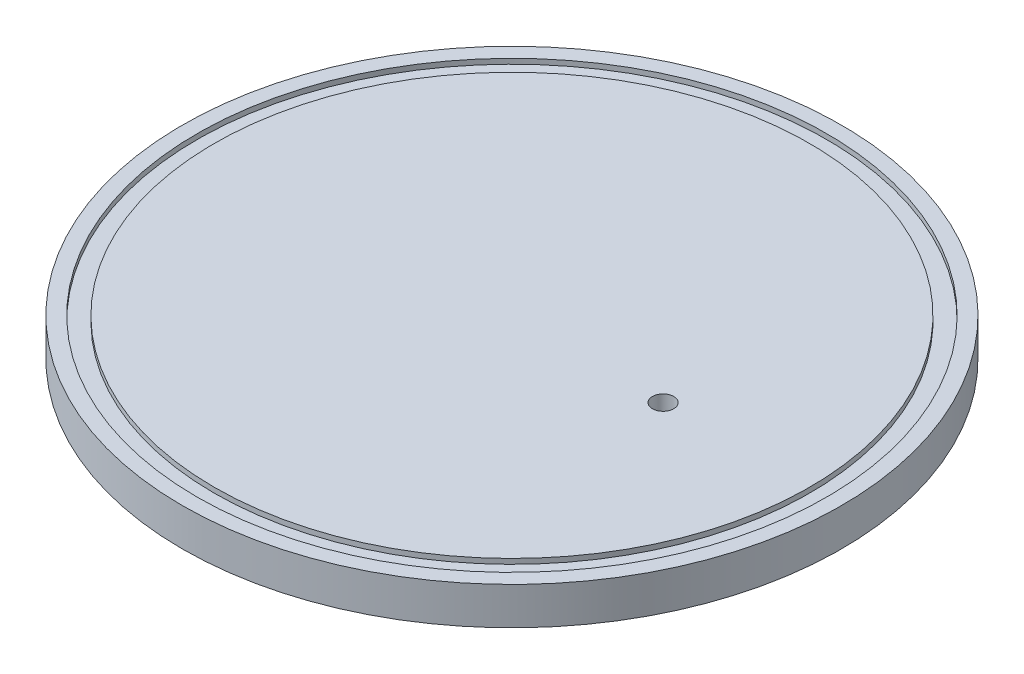
ISO-10303-21;
HEADER;
FILE_DESCRIPTION(('STEP AP214'),'2;1');
FILE_NAME('part.step','',(''),(''),'','','');
FILE_SCHEMA(('AUTOMOTIVE_DESIGN { 1 0 10303 214 1 1 1 1 }'));
ENDSEC;
DATA;
#1=APPLICATION_CONTEXT('core data for automotive mechanical design processes');
#2=APPLICATION_PROTOCOL_DEFINITION('international standard','automotive_design',2000,#1);
#3=PRODUCT_CONTEXT('',#1,'mechanical');
#4=PRODUCT('Part','Part','',(#3));
#5=PRODUCT_RELATED_PRODUCT_CATEGORY('part','',(#4));
#6=PRODUCT_DEFINITION_FORMATION('','',#4);
#7=PRODUCT_DEFINITION_CONTEXT('part definition',#1,'design');
#8=PRODUCT_DEFINITION('design','',#6,#7);
#9=PRODUCT_DEFINITION_SHAPE('','',#8);
#10=(LENGTH_UNIT() NAMED_UNIT(*) SI_UNIT(.MILLI.,.METRE.));
#11=(NAMED_UNIT(*) PLANE_ANGLE_UNIT() SI_UNIT($,.RADIAN.));
#12=(NAMED_UNIT(*) SI_UNIT($,.STERADIAN.) SOLID_ANGLE_UNIT());
#13=UNCERTAINTY_MEASURE_WITH_UNIT(LENGTH_MEASURE(1.E-05),#10,'distance_accuracy_value','');
#14=(GEOMETRIC_REPRESENTATION_CONTEXT(3) GLOBAL_UNCERTAINTY_ASSIGNED_CONTEXT((#13)) GLOBAL_UNIT_ASSIGNED_CONTEXT((#10,
#11,#12)) REPRESENTATION_CONTEXT('',''));
#15=CARTESIAN_POINT('',(0.,0.,0.));
#16=DIRECTION('',(0.,0.,1.));
#17=DIRECTION('',(1.,0.,0.));
#18=AXIS2_PLACEMENT_3D('',#15,#16,#17);
#19=CARTESIAN_POINT('',(0.,0.,0.));
#20=DIRECTION('',(0.,1.,0.));
#21=DIRECTION('',(0.,0.,1.));
#22=AXIS2_PLACEMENT_3D('',#19,#20,#21);
#23=PLANE('',#22);
#24=CARTESIAN_POINT('',(17.7,0.,0.));
#25=DIRECTION('',(0.,-1.,0.));
#26=DIRECTION('',(0.,0.,-1.));
#27=AXIS2_PLACEMENT_3D('',#24,#25,#26);
#28=CIRCLE('',#27,1.25);
#29=CARTESIAN_POINT('',(17.7,0.,-1.25));
#30=VERTEX_POINT('',#29);
#31=EDGE_CURVE('E259',#30,#30,#28,.T.);
#32=ORIENTED_EDGE('',*,*,#31,.F.);
#33=EDGE_LOOP('',(#32));
#34=FACE_BOUND('',#33,.T.);
#35=DIRECTION('',(0.,0.,-1.));
#36=VECTOR('',#35,1.);
#37=CARTESIAN_POINT('',(-2.5,0.,19.5));
#38=LINE('',#37,#36);
#39=CARTESIAN_POINT('',(-2.5,0.,19.5));
#40=VERTEX_POINT('',#39);
#41=CARTESIAN_POINT('',(-2.5,0.,10.5));
#42=VERTEX_POINT('',#41);
#43=EDGE_CURVE('E157',#40,#42,#38,.T.);
#44=ORIENTED_EDGE('',*,*,#43,.F.);
#45=DIRECTION('',(-1.,0.,0.));
#46=VECTOR('',#45,1.);
#47=CARTESIAN_POINT('',(2.5,0.,19.5));
#48=LINE('',#47,#46);
#49=CARTESIAN_POINT('',(2.5,0.,19.5));
#50=VERTEX_POINT('',#49);
#51=EDGE_CURVE('E169',#50,#40,#48,.T.);
#52=ORIENTED_EDGE('',*,*,#51,.F.);
#53=DIRECTION('',(0.,0.,1.));
#54=VECTOR('',#53,1.);
#55=CARTESIAN_POINT('',(2.5,0.,19.5));
#56=LINE('',#55,#54);
#57=CARTESIAN_POINT('',(2.5,0.,10.5));
#58=VERTEX_POINT('',#57);
#59=EDGE_CURVE('E165',#58,#50,#56,.T.);
#60=ORIENTED_EDGE('',*,*,#59,.F.);
#61=DIRECTION('',(1.,0.,0.));
#62=VECTOR('',#61,1.);
#63=CARTESIAN_POINT('',(2.5,0.,10.5));
#64=LINE('',#63,#62);
#65=EDGE_CURVE('E161',#42,#58,#64,.T.);
#66=ORIENTED_EDGE('',*,*,#65,.F.);
#67=EDGE_LOOP('',(#44,#52,#60,#66));
#68=FACE_BOUND('',#67,.T.);
#69=CARTESIAN_POINT('',(0.,0.,0.));
#70=DIRECTION('',(0.,1.,0.));
#71=DIRECTION('',(0.,0.,1.));
#72=AXIS2_PLACEMENT_3D('',#69,#70,#71);
#73=CIRCLE('',#72,38.5983960185112);
#74=CARTESIAN_POINT('',(0.,0.,38.5983960185112));
#75=VERTEX_POINT('',#74);
#76=EDGE_CURVE('E198',#75,#75,#73,.T.);
#77=ORIENTED_EDGE('',*,*,#76,.F.);
#78=EDGE_LOOP('',(#77));
#79=FACE_BOUND('',#78,.T.);
#80=DIRECTION('',(0.,0.,1.));
#81=VECTOR('',#80,1.);
#82=CARTESIAN_POINT('',(2.5,0.,-10.5));
#83=LINE('',#82,#81);
#84=CARTESIAN_POINT('',(2.5,0.,-19.5));
#85=VERTEX_POINT('',#84);
#86=CARTESIAN_POINT('',(2.5,0.,-10.5));
#87=VERTEX_POINT('',#86);
#88=EDGE_CURVE('E119',#85,#87,#83,.T.);
#89=ORIENTED_EDGE('',*,*,#88,.F.);
#90=DIRECTION('',(1.,0.,0.));
#91=VECTOR('',#90,1.);
#92=CARTESIAN_POINT('',(-2.5,0.,-19.5));
#93=LINE('',#92,#91);
#94=CARTESIAN_POINT('',(-2.5,0.,-19.5));
#95=VERTEX_POINT('',#94);
#96=EDGE_CURVE('E128',#95,#85,#93,.T.);
#97=ORIENTED_EDGE('',*,*,#96,.F.);
#98=DIRECTION('',(0.,0.,-1.));
#99=VECTOR('',#98,1.);
#100=CARTESIAN_POINT('',(-2.5,0.,-10.5));
#101=LINE('',#100,#99);
#102=CARTESIAN_POINT('',(-2.5,0.,-10.5));
#103=VERTEX_POINT('',#102);
#104=EDGE_CURVE('E143',#103,#95,#101,.T.);
#105=ORIENTED_EDGE('',*,*,#104,.F.);
#106=DIRECTION('',(-1.,0.,0.));
#107=VECTOR('',#106,1.);
#108=CARTESIAN_POINT('',(-2.5,0.,-10.5));
#109=LINE('',#108,#107);
#110=EDGE_CURVE('E136',#87,#103,#109,.T.);
#111=ORIENTED_EDGE('',*,*,#110,.F.);
#112=EDGE_LOOP('',(#89,#97,#105,#111));
#113=FACE_BOUND('',#112,.T.);
#114=ADVANCED_FACE('F39',(#34,#68,#79,#113),#23,.F.);
#115=CARTESIAN_POINT('',(0.,4.4,0.));
#116=DIRECTION('',(0.,-1.,0.));
#117=DIRECTION('',(0.,0.,-1.));
#118=AXIS2_PLACEMENT_3D('',#115,#116,#117);
#119=CYLINDRICAL_SURFACE('',#118,38.5983960185112);
#120=CARTESIAN_POINT('',(0.,4.4,0.));
#121=DIRECTION('',(0.,1.,0.));
#122=DIRECTION('',(0.,0.,1.));
#123=AXIS2_PLACEMENT_3D('',#120,#121,#122);
#124=CIRCLE('',#123,38.5983960185112);
#125=CARTESIAN_POINT('',(0.,4.4,38.5983960185112));
#126=VERTEX_POINT('',#125);
#127=EDGE_CURVE('E202',#126,#126,#124,.T.);
#128=ORIENTED_EDGE('',*,*,#127,.F.);
#129=EDGE_LOOP('',(#128));
#130=FACE_BOUND('',#129,.T.);
#131=ORIENTED_EDGE('',*,*,#76,.T.);
#132=EDGE_LOOP('',(#131));
#133=FACE_BOUND('',#132,.T.);
#134=ADVANCED_FACE('F292',(#130,#133),#119,.T.);
#135=CARTESIAN_POINT('',(0.,4.4,0.));
#136=DIRECTION('',(0.,1.,0.));
#137=DIRECTION('',(0.,0.,1.));
#138=AXIS2_PLACEMENT_3D('',#135,#136,#137);
#139=PLANE('',#138);
#140=CARTESIAN_POINT('',(0.,4.4,0.));
#141=DIRECTION('',(0.,1.,0.));
#142=DIRECTION('',(0.,0.,1.));
#143=AXIS2_PLACEMENT_3D('',#140,#141,#142);
#144=CIRCLE('',#143,36.8699223290354);
#145=CARTESIAN_POINT('',(0.,4.4,36.8699223290354));
#146=VERTEX_POINT('',#145);
#147=EDGE_CURVE('E190',#146,#146,#144,.T.);
#148=ORIENTED_EDGE('',*,*,#147,.F.);
#149=EDGE_LOOP('',(#148));
#150=FACE_BOUND('',#149,.T.);
#151=ORIENTED_EDGE('',*,*,#127,.T.);
#152=EDGE_LOOP('',(#151));
#153=FACE_BOUND('',#152,.T.);
#154=ADVANCED_FACE('F298',(#150,#153),#139,.T.);
#155=CARTESIAN_POINT('',(0.,3.8,0.));
#156=DIRECTION('',(0.,1.,0.));
#157=DIRECTION('',(0.,0.,1.));
#158=AXIS2_PLACEMENT_3D('',#155,#156,#157);
#159=CYLINDRICAL_SURFACE('',#158,36.8699223290354);
#160=CARTESIAN_POINT('',(0.,3.8,0.));
#161=DIRECTION('',(0.,1.,0.));
#162=DIRECTION('',(0.,0.,1.));
#163=AXIS2_PLACEMENT_3D('',#160,#161,#162);
#164=CIRCLE('',#163,36.8699223290354);
#165=CARTESIAN_POINT('',(0.,3.8,36.8699223290354));
#166=VERTEX_POINT('',#165);
#167=EDGE_CURVE('E194',#166,#166,#164,.T.);
#168=ORIENTED_EDGE('',*,*,#167,.F.);
#169=EDGE_LOOP('',(#168));
#170=FACE_BOUND('',#169,.T.);
#171=ORIENTED_EDGE('',*,*,#147,.T.);
#172=EDGE_LOOP('',(#171));
#173=FACE_BOUND('',#172,.T.);
#174=ADVANCED_FACE('F357',(#170,#173),#159,.F.);
#175=CARTESIAN_POINT('',(0.,3.8,0.));
#176=DIRECTION('',(0.,1.,0.));
#177=DIRECTION('',(0.,0.,1.));
#178=AXIS2_PLACEMENT_3D('',#175,#176,#177);
#179=PLANE('',#178);
#180=CARTESIAN_POINT('',(0.,3.8,0.));
#181=DIRECTION('',(0.,1.,0.));
#182=DIRECTION('',(0.,0.,1.));
#183=AXIS2_PLACEMENT_3D('',#180,#181,#182);
#184=CIRCLE('',#183,34.8699223290354);
#185=CARTESIAN_POINT('',(0.,3.8,34.8699223290354));
#186=VERTEX_POINT('',#185);
#187=EDGE_CURVE('E186',#186,#186,#184,.T.);
#188=ORIENTED_EDGE('',*,*,#187,.F.);
#189=EDGE_LOOP('',(#188));
#190=FACE_BOUND('',#189,.T.);
#191=ORIENTED_EDGE('',*,*,#167,.T.);
#192=EDGE_LOOP('',(#191));
#193=FACE_BOUND('',#192,.T.);
#194=ADVANCED_FACE('F354',(#190,#193),#179,.T.);
#195=CARTESIAN_POINT('',(0.,3.8,0.));
#196=DIRECTION('',(0.,1.,0.));
#197=DIRECTION('',(0.,0.,1.));
#198=AXIS2_PLACEMENT_3D('',#195,#196,#197);
#199=CYLINDRICAL_SURFACE('',#198,34.8699223290354);
#200=ORIENTED_EDGE('',*,*,#187,.T.);
#201=EDGE_LOOP('',(#200));
#202=FACE_BOUND('',#201,.T.);
#203=CARTESIAN_POINT('',(0.,4.4,0.));
#204=DIRECTION('',(0.,1.,0.));
#205=DIRECTION('',(0.,0.,1.));
#206=AXIS2_PLACEMENT_3D('',#203,#204,#205);
#207=CIRCLE('',#206,34.8699223290354);
#208=CARTESIAN_POINT('',(0.,4.4,34.8699223290354));
#209=VERTEX_POINT('',#208);
#210=EDGE_CURVE('E185',#209,#209,#207,.T.);
#211=ORIENTED_EDGE('',*,*,#210,.F.);
#212=EDGE_LOOP('',(#211));
#213=FACE_BOUND('',#212,.T.);
#214=ADVANCED_FACE('F349',(#202,#213),#199,.T.);
#215=CARTESIAN_POINT('',(17.7,4.4,0.));
#216=DIRECTION('',(0.,-1.,0.));
#217=DIRECTION('',(0.,0.,-1.));
#218=AXIS2_PLACEMENT_3D('',#215,#216,#217);
#219=CIRCLE('',#218,1.25);
#220=CARTESIAN_POINT('',(17.7,4.4,-1.25));
#221=VERTEX_POINT('',#220);
#222=EDGE_CURVE('E251',#221,#221,#219,.T.);
#223=ORIENTED_EDGE('',*,*,#222,.T.);
#224=EDGE_LOOP('',(#223));
#225=FACE_BOUND('',#224,.T.);
#226=ORIENTED_EDGE('',*,*,#210,.T.);
#227=EDGE_LOOP('',(#226));
#228=FACE_BOUND('',#227,.T.);
#229=ADVANCED_FACE('F341',(#225,#228),#139,.T.);
#230=CARTESIAN_POINT('',(-2.5,-14.5,19.5));
#231=DIRECTION('',(1.,0.,0.));
#232=DIRECTION('',(0.,0.,-1.));
#233=AXIS2_PLACEMENT_3D('',#230,#231,#232);
#234=PLANE('',#233);
#235=CARTESIAN_POINT('',(-2.5,-10.,15.));
#236=DIRECTION('',(1.,0.,0.));
#237=DIRECTION('',(0.,0.,-1.));
#238=AXIS2_PLACEMENT_3D('',#235,#236,#237);
#239=CIRCLE('',#238,1.55);
#240=CARTESIAN_POINT('',(-2.5,-10.,16.55));
#241=VERTEX_POINT('',#240);
#242=EDGE_CURVE('E246',#241,#241,#239,.T.);
#243=ORIENTED_EDGE('',*,*,#242,.T.);
#244=EDGE_LOOP('',(#243));
#245=FACE_BOUND('',#244,.T.);
#246=CARTESIAN_POINT('',(-2.5,-10.,15.));
#247=DIRECTION('',(1.,0.,0.));
#248=DIRECTION('',(0.,0.,-1.));
#249=AXIS2_PLACEMENT_3D('',#246,#247,#248);
#250=CIRCLE('',#249,4.5);
#251=CARTESIAN_POINT('',(-2.5,-10.,10.5));
#252=VERTEX_POINT('',#251);
#253=CARTESIAN_POINT('',(-2.5,-14.5,15.));
#254=VERTEX_POINT('',#253);
#255=EDGE_CURVE('E226',#252,#254,#250,.F.);
#256=ORIENTED_EDGE('',*,*,#255,.T.);
#257=CARTESIAN_POINT('',(-2.5,-10.,15.));
#258=DIRECTION('',(1.,0.,0.));
#259=DIRECTION('',(0.,0.,-1.));
#260=AXIS2_PLACEMENT_3D('',#257,#258,#259);
#261=CIRCLE('',#260,4.5);
#262=CARTESIAN_POINT('',(-2.5,-10.,19.5));
#263=VERTEX_POINT('',#262);
#264=EDGE_CURVE('E229',#254,#263,#261,.F.);
#265=ORIENTED_EDGE('',*,*,#264,.T.);
#266=DIRECTION('',(0.,1.,0.));
#267=VECTOR('',#266,1.);
#268=CARTESIAN_POINT('',(-2.5,-14.5,19.5));
#269=LINE('',#268,#267);
#270=EDGE_CURVE('E173',#263,#40,#269,.T.);
#271=ORIENTED_EDGE('',*,*,#270,.T.);
#272=ORIENTED_EDGE('',*,*,#43,.T.);
#273=DIRECTION('',(0.,1.,0.));
#274=VECTOR('',#273,1.);
#275=CARTESIAN_POINT('',(-2.5,-14.5,10.5));
#276=LINE('',#275,#274);
#277=EDGE_CURVE('E182',#252,#42,#276,.T.);
#278=ORIENTED_EDGE('',*,*,#277,.F.);
#279=EDGE_LOOP('',(#256,#265,#271,#272,#278));
#280=FACE_BOUND('',#279,.T.);
#281=ADVANCED_FACE('F339',(#245,#280),#234,.F.);
#282=CARTESIAN_POINT('',(2.5,-14.5,10.5));
#283=DIRECTION('',(0.,0.,1.));
#284=DIRECTION('',(1.,0.,0.));
#285=AXIS2_PLACEMENT_3D('',#282,#283,#284);
#286=PLANE('',#285);
#287=DIRECTION('',(0.,1.,0.));
#288=VECTOR('',#287,1.);
#289=CARTESIAN_POINT('',(2.5,-14.5,10.5));
#290=LINE('',#289,#288);
#291=CARTESIAN_POINT('',(2.5,-10.,10.5));
#292=VERTEX_POINT('',#291);
#293=EDGE_CURVE('E179',#292,#58,#290,.T.);
#294=ORIENTED_EDGE('',*,*,#293,.F.);
#295=DIRECTION('',(1.,0.,0.));
#296=VECTOR('',#295,1.);
#297=CARTESIAN_POINT('',(2.5,-10.,10.5));
#298=LINE('',#297,#296);
#299=EDGE_CURVE('E11',#292,#252,#298,.F.);
#300=ORIENTED_EDGE('',*,*,#299,.T.);
#301=ORIENTED_EDGE('',*,*,#277,.T.);
#302=ORIENTED_EDGE('',*,*,#65,.T.);
#303=EDGE_LOOP('',(#294,#300,#301,#302));
#304=FACE_BOUND('',#303,.T.);
#305=ADVANCED_FACE('F334',(#304),#286,.F.);
#306=CARTESIAN_POINT('',(2.5,-14.5,19.5));
#307=DIRECTION('',(-1.,0.,0.));
#308=DIRECTION('',(0.,0.,1.));
#309=AXIS2_PLACEMENT_3D('',#306,#307,#308);
#310=PLANE('',#309);
#311=CARTESIAN_POINT('',(2.5,-10.,15.));
#312=DIRECTION('',(-1.,0.,0.));
#313=DIRECTION('',(0.,0.,1.));
#314=AXIS2_PLACEMENT_3D('',#311,#312,#313);
#315=CIRCLE('',#314,1.55);
#316=CARTESIAN_POINT('',(2.49999999999999,-10.,16.55));
#317=VERTEX_POINT('',#316);
#318=EDGE_CURVE('E43',#317,#317,#315,.T.);
#319=ORIENTED_EDGE('',*,*,#318,.T.);
#320=EDGE_LOOP('',(#319));
#321=FACE_BOUND('',#320,.T.);
#322=DIRECTION('',(0.,1.,0.));
#323=VECTOR('',#322,1.);
#324=CARTESIAN_POINT('',(2.5,-14.5,19.5));
#325=LINE('',#324,#323);
#326=CARTESIAN_POINT('',(2.5,-10.,19.5));
#327=VERTEX_POINT('',#326);
#328=EDGE_CURVE('E176',#327,#50,#325,.T.);
#329=ORIENTED_EDGE('',*,*,#328,.F.);
#330=CARTESIAN_POINT('',(2.5,-10.,15.));
#331=DIRECTION('',(-1.,0.,0.));
#332=DIRECTION('',(0.,0.,1.));
#333=AXIS2_PLACEMENT_3D('',#330,#331,#332);
#334=CIRCLE('',#333,4.5);
#335=CARTESIAN_POINT('',(2.5,-14.5,15.));
#336=VERTEX_POINT('',#335);
#337=EDGE_CURVE('E49',#327,#336,#334,.F.);
#338=ORIENTED_EDGE('',*,*,#337,.T.);
#339=CARTESIAN_POINT('',(2.5,-10.,15.));
#340=DIRECTION('',(-1.,0.,0.));
#341=DIRECTION('',(0.,0.,1.));
#342=AXIS2_PLACEMENT_3D('',#339,#340,#341);
#343=CIRCLE('',#342,4.5);
#344=EDGE_CURVE('E57',#336,#292,#343,.F.);
#345=ORIENTED_EDGE('',*,*,#344,.T.);
#346=ORIENTED_EDGE('',*,*,#293,.T.);
#347=ORIENTED_EDGE('',*,*,#59,.T.);
#348=EDGE_LOOP('',(#329,#338,#345,#346,#347));
#349=FACE_BOUND('',#348,.T.);
#350=ADVANCED_FACE('F328',(#321,#349),#310,.F.);
#351=CARTESIAN_POINT('',(2.5,-14.5,19.5));
#352=DIRECTION('',(0.,0.,-1.));
#353=DIRECTION('',(-1.,0.,0.));
#354=AXIS2_PLACEMENT_3D('',#351,#352,#353);
#355=PLANE('',#354);
#356=ORIENTED_EDGE('',*,*,#270,.F.);
#357=DIRECTION('',(-1.,0.,0.));
#358=VECTOR('',#357,1.);
#359=CARTESIAN_POINT('',(2.5,-10.,19.5));
#360=LINE('',#359,#358);
#361=EDGE_CURVE('E232',#263,#327,#360,.F.);
#362=ORIENTED_EDGE('',*,*,#361,.T.);
#363=ORIENTED_EDGE('',*,*,#328,.T.);
#364=ORIENTED_EDGE('',*,*,#51,.T.);
#365=EDGE_LOOP('',(#356,#362,#363,#364));
#366=FACE_BOUND('',#365,.T.);
#367=ADVANCED_FACE('F326',(#366),#355,.F.);
#368=CARTESIAN_POINT('',(2.5,-14.5,-10.5));
#369=DIRECTION('',(-1.,0.,0.));
#370=DIRECTION('',(0.,0.,1.));
#371=AXIS2_PLACEMENT_3D('',#368,#369,#370);
#372=PLANE('',#371);
#373=CARTESIAN_POINT('',(2.5,-10.,-15.));
#374=DIRECTION('',(-1.,0.,0.));
#375=DIRECTION('',(0.,0.,1.));
#376=AXIS2_PLACEMENT_3D('',#373,#374,#375);
#377=CIRCLE('',#376,1.55);
#378=CARTESIAN_POINT('',(2.5,-10.,-13.45));
#379=VERTEX_POINT('',#378);
#380=EDGE_CURVE('E250',#379,#379,#377,.T.);
#381=ORIENTED_EDGE('',*,*,#380,.T.);
#382=EDGE_LOOP('',(#381));
#383=FACE_BOUND('',#382,.T.);
#384=CARTESIAN_POINT('',(2.5,-10.,-15.));
#385=DIRECTION('',(-1.,0.,0.));
#386=DIRECTION('',(0.,0.,1.));
#387=AXIS2_PLACEMENT_3D('',#384,#385,#386);
#388=CIRCLE('',#387,4.5);
#389=CARTESIAN_POINT('',(2.5,-10.,-10.5));
#390=VERTEX_POINT('',#389);
#391=CARTESIAN_POINT('',(2.5,-14.5,-15.));
#392=VERTEX_POINT('',#391);
#393=EDGE_CURVE('E206',#390,#392,#388,.F.);
#394=ORIENTED_EDGE('',*,*,#393,.T.);
#395=CARTESIAN_POINT('',(2.5,-10.,-15.));
#396=DIRECTION('',(-1.,0.,0.));
#397=DIRECTION('',(0.,0.,1.));
#398=AXIS2_PLACEMENT_3D('',#395,#396,#397);
#399=CIRCLE('',#398,4.5);
#400=CARTESIAN_POINT('',(2.5,-10.,-19.5));
#401=VERTEX_POINT('',#400);
#402=EDGE_CURVE('E121',#392,#401,#399,.F.);
#403=ORIENTED_EDGE('',*,*,#402,.T.);
#404=DIRECTION('',(0.,1.,0.));
#405=VECTOR('',#404,1.);
#406=CARTESIAN_POINT('',(2.5,-14.5,-19.5));
#407=LINE('',#406,#405);
#408=EDGE_CURVE('E115',#401,#85,#407,.T.);
#409=ORIENTED_EDGE('',*,*,#408,.T.);
#410=ORIENTED_EDGE('',*,*,#88,.T.);
#411=DIRECTION('',(0.,1.,0.));
#412=VECTOR('',#411,1.);
#413=CARTESIAN_POINT('',(2.5,-14.5,-10.5));
#414=LINE('',#413,#412);
#415=EDGE_CURVE('E154',#390,#87,#414,.T.);
#416=ORIENTED_EDGE('',*,*,#415,.F.);
#417=EDGE_LOOP('',(#394,#403,#409,#410,#416));
#418=FACE_BOUND('',#417,.T.);
#419=ADVANCED_FACE('F117',(#383,#418),#372,.F.);
#420=CARTESIAN_POINT('',(-2.5,-14.5,-10.5));
#421=DIRECTION('',(0.,0.,-1.));
#422=DIRECTION('',(-1.,0.,0.));
#423=AXIS2_PLACEMENT_3D('',#420,#421,#422);
#424=PLANE('',#423);
#425=DIRECTION('',(0.,1.,0.));
#426=VECTOR('',#425,1.);
#427=CARTESIAN_POINT('',(-2.5,-14.5,-10.5));
#428=LINE('',#427,#426);
#429=CARTESIAN_POINT('',(-2.5,-10.,-10.5));
#430=VERTEX_POINT('',#429);
#431=EDGE_CURVE('E151',#430,#103,#428,.T.);
#432=ORIENTED_EDGE('',*,*,#431,.F.);
#433=DIRECTION('',(-1.,0.,0.));
#434=VECTOR('',#433,1.);
#435=CARTESIAN_POINT('',(2.5,-10.,-10.5));
#436=LINE('',#435,#434);
#437=EDGE_CURVE('E223',#430,#390,#436,.F.);
#438=ORIENTED_EDGE('',*,*,#437,.T.);
#439=ORIENTED_EDGE('',*,*,#415,.T.);
#440=ORIENTED_EDGE('',*,*,#110,.T.);
#441=EDGE_LOOP('',(#432,#438,#439,#440));
#442=FACE_BOUND('',#441,.T.);
#443=ADVANCED_FACE('F272',(#442),#424,.F.);
#444=CARTESIAN_POINT('',(-2.5,-14.5,-10.5));
#445=DIRECTION('',(1.,0.,0.));
#446=DIRECTION('',(0.,0.,-1.));
#447=AXIS2_PLACEMENT_3D('',#444,#445,#446);
#448=PLANE('',#447);
#449=CARTESIAN_POINT('',(-2.5,-10.,-15.));
#450=DIRECTION('',(1.,0.,0.));
#451=DIRECTION('',(0.,0.,-1.));
#452=AXIS2_PLACEMENT_3D('',#449,#450,#451);
#453=CIRCLE('',#452,1.55);
#454=CARTESIAN_POINT('',(-2.5,-10.,-13.45));
#455=VERTEX_POINT('',#454);
#456=EDGE_CURVE('E247',#455,#455,#453,.T.);
#457=ORIENTED_EDGE('',*,*,#456,.T.);
#458=EDGE_LOOP('',(#457));
#459=FACE_BOUND('',#458,.T.);
#460=DIRECTION('',(0.,1.,0.));
#461=VECTOR('',#460,1.);
#462=CARTESIAN_POINT('',(-2.5,-14.5,-19.5));
#463=LINE('',#462,#461);
#464=CARTESIAN_POINT('',(-2.5,-10.,-19.5));
#465=VERTEX_POINT('',#464);
#466=EDGE_CURVE('E127',#465,#95,#463,.T.);
#467=ORIENTED_EDGE('',*,*,#466,.F.);
#468=CARTESIAN_POINT('',(-2.5,-10.,-15.));
#469=DIRECTION('',(1.,0.,0.));
#470=DIRECTION('',(0.,0.,-1.));
#471=AXIS2_PLACEMENT_3D('',#468,#469,#470);
#472=CIRCLE('',#471,4.5);
#473=CARTESIAN_POINT('',(-2.5,-14.5,-15.));
#474=VERTEX_POINT('',#473);
#475=EDGE_CURVE('E220',#465,#474,#472,.F.);
#476=ORIENTED_EDGE('',*,*,#475,.T.);
#477=CARTESIAN_POINT('',(-2.5,-10.,-15.));
#478=DIRECTION('',(1.,0.,0.));
#479=DIRECTION('',(0.,0.,-1.));
#480=AXIS2_PLACEMENT_3D('',#477,#478,#479);
#481=CIRCLE('',#480,4.5);
#482=EDGE_CURVE('E217',#474,#430,#481,.F.);
#483=ORIENTED_EDGE('',*,*,#482,.T.);
#484=ORIENTED_EDGE('',*,*,#431,.T.);
#485=ORIENTED_EDGE('',*,*,#104,.T.);
#486=EDGE_LOOP('',(#467,#476,#483,#484,#485));
#487=FACE_BOUND('',#486,.T.);
#488=ADVANCED_FACE('F282',(#459,#487),#448,.F.);
#489=CARTESIAN_POINT('',(-2.5,-14.5,-19.5));
#490=DIRECTION('',(0.,0.,1.));
#491=DIRECTION('',(1.,0.,0.));
#492=AXIS2_PLACEMENT_3D('',#489,#490,#491);
#493=PLANE('',#492);
#494=ORIENTED_EDGE('',*,*,#408,.F.);
#495=DIRECTION('',(1.,0.,0.));
#496=VECTOR('',#495,1.);
#497=CARTESIAN_POINT('',(-2.5,-10.,-19.5));
#498=LINE('',#497,#496);
#499=EDGE_CURVE('E214',#401,#465,#498,.F.);
#500=ORIENTED_EDGE('',*,*,#499,.T.);
#501=ORIENTED_EDGE('',*,*,#466,.T.);
#502=ORIENTED_EDGE('',*,*,#96,.T.);
#503=EDGE_LOOP('',(#494,#500,#501,#502));
#504=FACE_BOUND('',#503,.T.);
#505=ADVANCED_FACE('F140',(#504),#493,.F.);
#506=CARTESIAN_POINT('',(0.,-10.,-15.));
#507=DIRECTION('',(1.,0.,0.));
#508=DIRECTION('',(0.,0.,-1.));
#509=AXIS2_PLACEMENT_3D('',#506,#507,#508);
#510=CYLINDRICAL_SURFACE('',#509,4.5);
#511=ORIENTED_EDGE('',*,*,#437,.F.);
#512=ORIENTED_EDGE('',*,*,#482,.F.);
#513=DIRECTION('',(-1.,0.,0.));
#514=VECTOR('',#513,1.);
#515=CARTESIAN_POINT('',(-2.5,-14.5,-15.));
#516=LINE('',#515,#514);
#517=EDGE_CURVE('E138',#392,#474,#516,.T.);
#518=ORIENTED_EDGE('',*,*,#517,.F.);
#519=ORIENTED_EDGE('',*,*,#393,.F.);
#520=EDGE_LOOP('',(#511,#512,#518,#519));
#521=FACE_BOUND('',#520,.T.);
#522=ADVANCED_FACE('F277',(#521),#510,.T.);
#523=CARTESIAN_POINT('',(0.,-10.,-15.));
#524=DIRECTION('',(-1.,0.,0.));
#525=DIRECTION('',(0.,0.,1.));
#526=AXIS2_PLACEMENT_3D('',#523,#524,#525);
#527=CYLINDRICAL_SURFACE('',#526,4.5);
#528=ORIENTED_EDGE('',*,*,#475,.F.);
#529=ORIENTED_EDGE('',*,*,#499,.F.);
#530=ORIENTED_EDGE('',*,*,#402,.F.);
#531=ORIENTED_EDGE('',*,*,#517,.T.);
#532=EDGE_LOOP('',(#528,#529,#530,#531));
#533=FACE_BOUND('',#532,.T.);
#534=ADVANCED_FACE('F280',(#533),#527,.T.);
#535=CARTESIAN_POINT('',(0.,-10.,15.));
#536=DIRECTION('',(1.,0.,0.));
#537=DIRECTION('',(0.,0.,-1.));
#538=AXIS2_PLACEMENT_3D('',#535,#536,#537);
#539=CYLINDRICAL_SURFACE('',#538,4.5);
#540=ORIENTED_EDGE('',*,*,#299,.F.);
#541=ORIENTED_EDGE('',*,*,#344,.F.);
#542=DIRECTION('',(1.,0.,0.));
#543=VECTOR('',#542,1.);
#544=CARTESIAN_POINT('',(0.,-14.5,15.));
#545=LINE('',#544,#543);
#546=EDGE_CURVE('E243',#254,#336,#545,.T.);
#547=ORIENTED_EDGE('',*,*,#546,.F.);
#548=ORIENTED_EDGE('',*,*,#255,.F.);
#549=EDGE_LOOP('',(#540,#541,#547,#548));
#550=FACE_BOUND('',#549,.T.);
#551=ADVANCED_FACE('F41',(#550),#539,.T.);
#552=CARTESIAN_POINT('',(0.,-10.,15.));
#553=DIRECTION('',(-1.,0.,0.));
#554=DIRECTION('',(0.,0.,1.));
#555=AXIS2_PLACEMENT_3D('',#552,#553,#554);
#556=CYLINDRICAL_SURFACE('',#555,4.5);
#557=ORIENTED_EDGE('',*,*,#337,.F.);
#558=ORIENTED_EDGE('',*,*,#361,.F.);
#559=ORIENTED_EDGE('',*,*,#264,.F.);
#560=ORIENTED_EDGE('',*,*,#546,.T.);
#561=EDGE_LOOP('',(#557,#558,#559,#560));
#562=FACE_BOUND('',#561,.T.);
#563=ADVANCED_FACE('F309',(#562),#556,.T.);
#564=CARTESIAN_POINT('',(38.5983960185112,-10.,-15.));
#565=DIRECTION('',(-1.,0.,0.));
#566=DIRECTION('',(0.,0.,1.));
#567=AXIS2_PLACEMENT_3D('',#564,#565,#566);
#568=CYLINDRICAL_SURFACE('',#567,1.55);
#569=CARTESIAN_POINT('',(-2.5,-10.,-13.45));
#570=CARTESIAN_POINT('',(-2.44791666666667,-10.,-13.45));
#571=CARTESIAN_POINT('',(-2.39583333333334,-10.,-13.45));
#572=CARTESIAN_POINT('',(-2.29166666666667,-10.,-13.45));
#573=CARTESIAN_POINT('',(-2.23958333333334,-10.,-13.45));
#574=CARTESIAN_POINT('',(-2.13541666666667,-10.,-13.45));
#575=CARTESIAN_POINT('',(-2.08333333333333,-10.,-13.45));
#576=CARTESIAN_POINT('',(-1.97916666666667,-10.,-13.45));
#577=CARTESIAN_POINT('',(-1.92708333333333,-10.,-13.45));
#578=CARTESIAN_POINT('',(-1.82291666666667,-10.,-13.45));
#579=CARTESIAN_POINT('',(-1.77083333333334,-10.,-13.45));
#580=CARTESIAN_POINT('',(-1.66666666666667,-10.,-13.45));
#581=CARTESIAN_POINT('',(-1.61458333333334,-10.,-13.45));
#582=CARTESIAN_POINT('',(-1.51041666666667,-10.,-13.45));
#583=CARTESIAN_POINT('',(-1.45833333333333,-10.,-13.45));
#584=CARTESIAN_POINT('',(-1.35416666666667,-10.,-13.45));
#585=CARTESIAN_POINT('',(-1.30208333333333,-10.,-13.45));
#586=CARTESIAN_POINT('',(-1.19791666666667,-10.,-13.45));
#587=CARTESIAN_POINT('',(-1.14583333333334,-10.,-13.45));
#588=CARTESIAN_POINT('',(-1.04166666666667,-10.,-13.45));
#589=CARTESIAN_POINT('',(-0.989583333333335,-10.,-13.45));
#590=CARTESIAN_POINT('',(-0.885416666666666,-10.,-13.45));
#591=CARTESIAN_POINT('',(-0.833333333333332,-10.,-13.45));
#592=CARTESIAN_POINT('',(-0.729166666666665,-10.,-13.45));
#593=CARTESIAN_POINT('',(-0.677083333333333,-10.,-13.45));
#594=CARTESIAN_POINT('',(-0.572916666666668,-10.,-13.45));
#595=CARTESIAN_POINT('',(-0.520833333333336,-10.,-13.45));
#596=CARTESIAN_POINT('',(-0.416666666666669,-10.,-13.45));
#597=CARTESIAN_POINT('',(-0.364583333333335,-10.,-13.45));
#598=CARTESIAN_POINT('',(-0.260416666666666,-10.,-13.45));
#599=CARTESIAN_POINT('',(-0.208333333333331,-10.,-13.45));
#600=CARTESIAN_POINT('',(-0.104166666666664,-10.,-13.45));
#601=CARTESIAN_POINT('',(-0.0520833333333322,-10.,-13.45));
#602=CARTESIAN_POINT('',(0.0520833333333322,-10.,-13.45));
#603=CARTESIAN_POINT('',(0.104166666666664,-10.,-13.45));
#604=CARTESIAN_POINT('',(0.208333333333331,-10.,-13.45));
#605=CARTESIAN_POINT('',(0.260416666666666,-10.,-13.45));
#606=CARTESIAN_POINT('',(0.364583333333335,-10.,-13.45));
#607=CARTESIAN_POINT('',(0.416666666666669,-10.,-13.45));
#608=CARTESIAN_POINT('',(0.520833333333336,-10.,-13.45));
#609=CARTESIAN_POINT('',(0.572916666666668,-10.,-13.45));
#610=CARTESIAN_POINT('',(0.677083333333333,-10.,-13.45));
#611=CARTESIAN_POINT('',(0.729166666666665,-10.,-13.45));
#612=CARTESIAN_POINT('',(0.833333333333332,-10.,-13.45));
#613=CARTESIAN_POINT('',(0.885416666666666,-10.,-13.45));
#614=CARTESIAN_POINT('',(0.989583333333335,-10.,-13.45));
#615=CARTESIAN_POINT('',(1.04166666666667,-10.,-13.45));
#616=CARTESIAN_POINT('',(1.14583333333334,-10.,-13.45));
#617=CARTESIAN_POINT('',(1.19791666666667,-10.,-13.45));
#618=CARTESIAN_POINT('',(1.30208333333333,-10.,-13.45));
#619=CARTESIAN_POINT('',(1.35416666666667,-10.,-13.45));
#620=CARTESIAN_POINT('',(1.45833333333333,-10.,-13.45));
#621=CARTESIAN_POINT('',(1.51041666666667,-10.,-13.45));
#622=CARTESIAN_POINT('',(1.61458333333334,-10.,-13.45));
#623=CARTESIAN_POINT('',(1.66666666666667,-10.,-13.45));
#624=CARTESIAN_POINT('',(1.77083333333334,-10.,-13.45));
#625=CARTESIAN_POINT('',(1.82291666666667,-10.,-13.45));
#626=CARTESIAN_POINT('',(1.92708333333333,-10.,-13.45));
#627=CARTESIAN_POINT('',(1.97916666666667,-10.,-13.45));
#628=CARTESIAN_POINT('',(2.08333333333333,-10.,-13.45));
#629=CARTESIAN_POINT('',(2.13541666666667,-10.,-13.45));
#630=CARTESIAN_POINT('',(2.23958333333334,-10.,-13.45));
#631=CARTESIAN_POINT('',(2.29166666666667,-10.,-13.45));
#632=CARTESIAN_POINT('',(2.39583333333334,-10.,-13.45));
#633=CARTESIAN_POINT('',(2.44791666666667,-10.,-13.45));
#634=CARTESIAN_POINT('',(2.5,-10.,-13.45));
#635=B_SPLINE_CURVE_WITH_KNOTS('',3,(#569,#570,#571,#572,#573,#574,#575,#576,#577,#578,#579,
#580,#581,#582,#583,#584,#585,#586,#587,#588,#589,#590,#591,#592,#593,#594,#595,#596,#597,#598,
#599,#600,#601,#602,#603,#604,#605,#606,#607,#608,#609,#610,#611,#612,#613,#614,#615,#616,#617,
#618,#619,#620,#621,#622,#623,#624,#625,#626,#627,#628,#629,#630,#631,#632,#633,#634),
.UNSPECIFIED.,.F.,.F.,(4,2,2,2,2,2,2,2,2,2,2,2,2,2,2,2,2,2,2,2,2,2,2,2,2,2,2,2,2,2,2,2,4),(0.,
0.156249999999997,0.3125,0.468750000000004,0.625000000000001,0.781249999999997,
0.937500000000001,1.09375,1.25,1.40625,1.5625,1.71875,1.875,2.03125,2.1875,2.34375000000001,2.5,
2.65625,2.8125,2.96875000000001,3.125,3.28125,3.4375,3.59375000000001,3.75,3.90625,4.0625,
4.21875000000001,4.375,4.53125,4.6875,4.84375000000001,5.),.UNSPECIFIED.);
#636=EDGE_CURVE('BSEAM311',#455,#379,#635,.T.);
#637=ORIENTED_EDGE('',*,*,#456,.F.);
#638=ORIENTED_EDGE('',*,*,#380,.F.);
#639=ORIENTED_EDGE('',*,*,#636,.T.);
#640=ORIENTED_EDGE('',*,*,#636,.F.);
#641=EDGE_LOOP('',(#637,#639,#638,#640));
#642=FACE_BOUND('',#641,.T.);
#643=ADVANCED_FACE('F311',(#642),#568,.F.);
#644=CARTESIAN_POINT('',(38.5983960185112,-10.,15.));
#645=DIRECTION('',(-1.,0.,0.));
#646=DIRECTION('',(0.,0.,1.));
#647=AXIS2_PLACEMENT_3D('',#644,#645,#646);
#648=CYLINDRICAL_SURFACE('',#647,1.55);
#649=CARTESIAN_POINT('',(2.49999999999999,-10.,16.55));
#650=CARTESIAN_POINT('',(2.44791666666666,-10.,16.55));
#651=CARTESIAN_POINT('',(2.39583333333332,-10.,16.55));
#652=CARTESIAN_POINT('',(2.29166666666666,-10.,16.55));
#653=CARTESIAN_POINT('',(2.23958333333332,-10.,16.55));
#654=CARTESIAN_POINT('',(2.13541666666666,-10.,16.55));
#655=CARTESIAN_POINT('',(2.08333333333332,-10.,16.55));
#656=CARTESIAN_POINT('',(1.97916666666666,-10.,16.55));
#657=CARTESIAN_POINT('',(1.92708333333332,-10.,16.55));
#658=CARTESIAN_POINT('',(1.82291666666666,-10.,16.55));
#659=CARTESIAN_POINT('',(1.77083333333332,-10.,16.55));
#660=CARTESIAN_POINT('',(1.66666666666666,-10.,16.55));
#661=CARTESIAN_POINT('',(1.61458333333332,-10.,16.55));
#662=CARTESIAN_POINT('',(1.51041666666666,-10.,16.55));
#663=CARTESIAN_POINT('',(1.45833333333332,-10.,16.55));
#664=CARTESIAN_POINT('',(1.35416666666666,-10.,16.55));
#665=CARTESIAN_POINT('',(1.30208333333332,-10.,16.55));
#666=CARTESIAN_POINT('',(1.19791666666665,-10.,16.55));
#667=CARTESIAN_POINT('',(1.14583333333332,-10.,16.55));
#668=CARTESIAN_POINT('',(1.04166666666666,-10.,16.55));
#669=CARTESIAN_POINT('',(0.989583333333326,-10.,16.55));
#670=CARTESIAN_POINT('',(0.885416666666659,-10.,16.55));
#671=CARTESIAN_POINT('',(0.833333333333325,-10.,16.55));
#672=CARTESIAN_POINT('',(0.729166666666658,-10.,16.55));
#673=CARTESIAN_POINT('',(0.677083333333326,-10.,16.55));
#674=CARTESIAN_POINT('',(0.572916666666659,-10.,16.55));
#675=CARTESIAN_POINT('',(0.520833333333325,-10.,16.55));
#676=CARTESIAN_POINT('',(0.416666666666658,-10.,16.55));
#677=CARTESIAN_POINT('',(0.364583333333326,-10.,16.55));
#678=CARTESIAN_POINT('',(0.260416666666659,-10.,16.55));
#679=CARTESIAN_POINT('',(0.208333333333324,-10.,16.55));
#680=CARTESIAN_POINT('',(0.104166666666657,-10.,16.55));
#681=CARTESIAN_POINT('',(0.0520833333333253,-10.,16.55));
#682=CARTESIAN_POINT('',(-0.0520833333333392,-10.,16.55));
#683=CARTESIAN_POINT('',(-0.104166666666671,-10.,16.55));
#684=CARTESIAN_POINT('',(-0.208333333333338,-10.,16.55));
#685=CARTESIAN_POINT('',(-0.260416666666673,-10.,16.55));
#686=CARTESIAN_POINT('',(-0.364583333333339,-10.,16.55));
#687=CARTESIAN_POINT('',(-0.416666666666672,-10.,16.55));
#688=CARTESIAN_POINT('',(-0.520833333333338,-10.,16.55));
#689=CARTESIAN_POINT('',(-0.572916666666673,-10.,16.55));
#690=CARTESIAN_POINT('',(-0.67708333333334,-10.,16.55));
#691=CARTESIAN_POINT('',(-0.729166666666672,-10.,16.55));
#692=CARTESIAN_POINT('',(-0.833333333333339,-10.,16.55));
#693=CARTESIAN_POINT('',(-0.885416666666673,-10.,16.55));
#694=CARTESIAN_POINT('',(-0.98958333333334,-10.,16.55));
#695=CARTESIAN_POINT('',(-1.04166666666667,-10.,16.55));
#696=CARTESIAN_POINT('',(-1.14583333333334,-10.,16.55));
#697=CARTESIAN_POINT('',(-1.19791666666667,-10.,16.55));
#698=CARTESIAN_POINT('',(-1.30208333333334,-10.,16.55));
#699=CARTESIAN_POINT('',(-1.35416666666667,-10.,16.55));
#700=CARTESIAN_POINT('',(-1.45833333333334,-10.,16.55));
#701=CARTESIAN_POINT('',(-1.51041666666667,-10.,16.55));
#702=CARTESIAN_POINT('',(-1.61458333333334,-10.,16.55));
#703=CARTESIAN_POINT('',(-1.66666666666667,-10.,16.55));
#704=CARTESIAN_POINT('',(-1.77083333333334,-10.,16.55));
#705=CARTESIAN_POINT('',(-1.82291666666667,-10.,16.55));
#706=CARTESIAN_POINT('',(-1.92708333333334,-10.,16.55));
#707=CARTESIAN_POINT('',(-1.97916666666667,-10.,16.55));
#708=CARTESIAN_POINT('',(-2.08333333333334,-10.,16.55));
#709=CARTESIAN_POINT('',(-2.13541666666667,-10.,16.55));
#710=CARTESIAN_POINT('',(-2.23958333333334,-10.,16.55));
#711=CARTESIAN_POINT('',(-2.29166666666667,-10.,16.55));
#712=CARTESIAN_POINT('',(-2.39583333333334,-10.,16.55));
#713=CARTESIAN_POINT('',(-2.44791666666667,-10.,16.55));
#714=CARTESIAN_POINT('',(-2.5,-10.,16.55));
#715=B_SPLINE_CURVE_WITH_KNOTS('',3,(#649,#650,#651,#652,#653,#654,#655,#656,#657,#658,#659,
#660,#661,#662,#663,#664,#665,#666,#667,#668,#669,#670,#671,#672,#673,#674,#675,#676,#677,#678,
#679,#680,#681,#682,#683,#684,#685,#686,#687,#688,#689,#690,#691,#692,#693,#694,#695,#696,#697,
#698,#699,#700,#701,#702,#703,#704,#705,#706,#707,#708,#709,#710,#711,#712,#713,#714),
.UNSPECIFIED.,.F.,.F.,(4,2,2,2,2,2,2,2,2,2,2,2,2,2,2,2,2,2,2,2,2,2,2,2,2,2,2,2,2,2,2,2,4),(0.,
0.156249999999997,0.3125,0.468749999999997,0.625000000000001,0.781249999999997,
0.937500000000001,1.09375,1.25,1.40625,1.56249999999999,1.71875,1.87499999999999,2.03125,2.1875,
2.34375,2.5,2.65624999999999,2.8125,2.96874999999999,3.125,3.28124999999999,3.4375,
3.59374999999999,3.74999999999999,3.90624999999999,4.06249999999999,4.21874999999999,
4.37499999999999,4.53124999999999,4.68749999999999,4.84374999999999,4.99999999999999),.UNSPECIFIED.);
#716=EDGE_CURVE('BSEAM317',#317,#241,#715,.T.);
#717=ORIENTED_EDGE('',*,*,#318,.F.);
#718=ORIENTED_EDGE('',*,*,#242,.F.);
#719=ORIENTED_EDGE('',*,*,#716,.T.);
#720=ORIENTED_EDGE('',*,*,#716,.F.);
#721=EDGE_LOOP('',(#717,#719,#718,#720));
#722=FACE_BOUND('',#721,.T.);
#723=ADVANCED_FACE('F317',(#722),#648,.F.);
#724=CARTESIAN_POINT('',(17.7,4.4,0.));
#725=DIRECTION('',(0.,-1.,0.));
#726=DIRECTION('',(0.,0.,-1.));
#727=AXIS2_PLACEMENT_3D('',#724,#725,#726);
#728=CYLINDRICAL_SURFACE('',#727,1.25);
#729=ORIENTED_EDGE('',*,*,#222,.F.);
#730=EDGE_LOOP('',(#729));
#731=FACE_BOUND('',#730,.T.);
#732=ORIENTED_EDGE('',*,*,#31,.T.);
#733=EDGE_LOOP('',(#732));
#734=FACE_BOUND('',#733,.T.);
#735=ADVANCED_FACE('F484',(#731,#734),#728,.F.);
#736=CLOSED_SHELL('',(#114,#134,#154,#174,#194,#214,#229,#281,#305,#350,#367,#419,#443,#488,
#505,#522,#534,#551,#563,#643,#723,#735));
#737=MANIFOLD_SOLID_BREP('B2',#736);
#738=ADVANCED_BREP_SHAPE_REPRESENTATION('',(#18,#737),#14);
#739=SHAPE_DEFINITION_REPRESENTATION(#9,#738);
ENDSEC;
END-ISO-10303-21;
